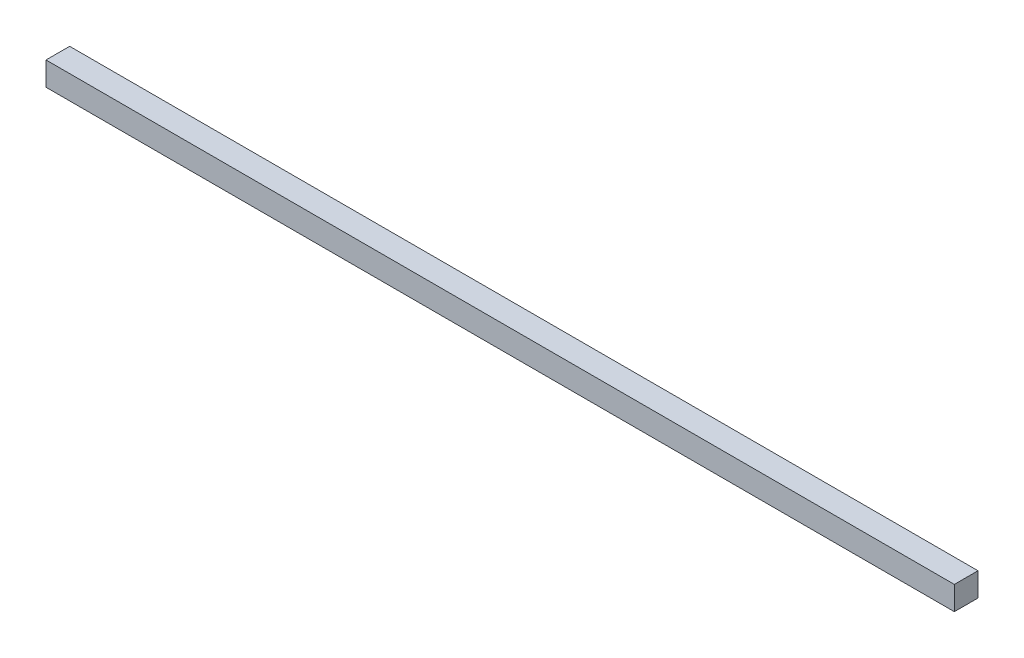
ISO-10303-21;
HEADER;
FILE_DESCRIPTION(('STEP AP214'),'2;1');
FILE_NAME('part.step','',(''),(''),'','','');
FILE_SCHEMA(('AUTOMOTIVE_DESIGN { 1 0 10303 214 1 1 1 1 }'));
ENDSEC;
DATA;
#1=APPLICATION_CONTEXT('core data for automotive mechanical design processes');
#2=APPLICATION_PROTOCOL_DEFINITION('international standard','automotive_design',2000,#1);
#3=PRODUCT_CONTEXT('',#1,'mechanical');
#4=PRODUCT('Part','Part','',(#3));
#5=PRODUCT_RELATED_PRODUCT_CATEGORY('part','',(#4));
#6=PRODUCT_DEFINITION_FORMATION('','',#4);
#7=PRODUCT_DEFINITION_CONTEXT('part definition',#1,'design');
#8=PRODUCT_DEFINITION('design','',#6,#7);
#9=PRODUCT_DEFINITION_SHAPE('','',#8);
#10=(LENGTH_UNIT() NAMED_UNIT(*) SI_UNIT(.MILLI.,.METRE.));
#11=(NAMED_UNIT(*) PLANE_ANGLE_UNIT() SI_UNIT($,.RADIAN.));
#12=(NAMED_UNIT(*) SI_UNIT($,.STERADIAN.) SOLID_ANGLE_UNIT());
#13=UNCERTAINTY_MEASURE_WITH_UNIT(LENGTH_MEASURE(1.E-05),#10,'distance_accuracy_value','');
#14=(GEOMETRIC_REPRESENTATION_CONTEXT(3) GLOBAL_UNCERTAINTY_ASSIGNED_CONTEXT((#13)) GLOBAL_UNIT_ASSIGNED_CONTEXT((#10,
#11,#12)) REPRESENTATION_CONTEXT('',''));
#15=CARTESIAN_POINT('',(0.,0.,0.));
#16=DIRECTION('',(0.,0.,1.));
#17=DIRECTION('',(1.,0.,0.));
#18=AXIS2_PLACEMENT_3D('',#15,#16,#17);
#19=CARTESIAN_POINT('',(-192.,5.,5.));
#20=DIRECTION('',(1.,0.,0.));
#21=DIRECTION('',(0.,0.,-1.));
#22=AXIS2_PLACEMENT_3D('',#19,#20,#21);
#23=PLANE('',#22);
#24=DIRECTION('',(0.,-1.,0.));
#25=VECTOR('',#24,1.);
#26=CARTESIAN_POINT('',(-192.,5.,-5.));
#27=LINE('',#26,#25);
#28=CARTESIAN_POINT('',(-192.,5.,-5.));
#29=VERTEX_POINT('',#28);
#30=CARTESIAN_POINT('',(-192.,-5.,-5.));
#31=VERTEX_POINT('',#30);
#32=EDGE_CURVE('E105',#29,#31,#27,.T.);
#33=ORIENTED_EDGE('',*,*,#32,.T.);
#34=DIRECTION('',(0.,0.,-1.));
#35=VECTOR('',#34,1.);
#36=CARTESIAN_POINT('',(-192.,-5.,5.));
#37=LINE('',#36,#35);
#38=CARTESIAN_POINT('',(-192.,-5.,5.));
#39=VERTEX_POINT('',#38);
#40=EDGE_CURVE('E11',#39,#31,#37,.T.);
#41=ORIENTED_EDGE('',*,*,#40,.F.);
#42=DIRECTION('',(0.,-1.,0.));
#43=VECTOR('',#42,1.);
#44=CARTESIAN_POINT('',(-192.,5.,5.));
#45=LINE('',#44,#43);
#46=CARTESIAN_POINT('',(-192.,5.,5.));
#47=VERTEX_POINT('',#46);
#48=EDGE_CURVE('E89',#47,#39,#45,.T.);
#49=ORIENTED_EDGE('',*,*,#48,.F.);
#50=DIRECTION('',(0.,0.,-1.));
#51=VECTOR('',#50,1.);
#52=CARTESIAN_POINT('',(-192.,5.,5.));
#53=LINE('',#52,#51);
#54=EDGE_CURVE('E98',#47,#29,#53,.T.);
#55=ORIENTED_EDGE('',*,*,#54,.T.);
#56=EDGE_LOOP('',(#33,#41,#49,#55));
#57=FACE_BOUND('',#56,.T.);
#58=ADVANCED_FACE('F39',(#57),#23,.F.);
#59=CARTESIAN_POINT('',(-192.,-5.,5.));
#60=DIRECTION('',(0.,1.,0.));
#61=DIRECTION('',(0.,0.,1.));
#62=AXIS2_PLACEMENT_3D('',#59,#60,#61);
#63=PLANE('',#62);
#64=DIRECTION('',(1.,0.,0.));
#65=VECTOR('',#64,1.);
#66=CARTESIAN_POINT('',(-192.,-5.,-5.));
#67=LINE('',#66,#65);
#68=CARTESIAN_POINT('',(192.,-5.,-5.));
#69=VERTEX_POINT('',#68);
#70=EDGE_CURVE('E94',#31,#69,#67,.T.);
#71=ORIENTED_EDGE('',*,*,#70,.T.);
#72=DIRECTION('',(0.,0.,-1.));
#73=VECTOR('',#72,1.);
#74=CARTESIAN_POINT('',(192.,-5.,5.));
#75=LINE('',#74,#73);
#76=CARTESIAN_POINT('',(192.,-5.,5.));
#77=VERTEX_POINT('',#76);
#78=EDGE_CURVE('E50',#77,#69,#75,.T.);
#79=ORIENTED_EDGE('',*,*,#78,.F.);
#80=DIRECTION('',(1.,0.,0.));
#81=VECTOR('',#80,1.);
#82=CARTESIAN_POINT('',(-192.,-5.,5.));
#83=LINE('',#82,#81);
#84=EDGE_CURVE('E84',#39,#77,#83,.T.);
#85=ORIENTED_EDGE('',*,*,#84,.F.);
#86=ORIENTED_EDGE('',*,*,#40,.T.);
#87=EDGE_LOOP('',(#71,#79,#85,#86));
#88=FACE_BOUND('',#87,.T.);
#89=ADVANCED_FACE('F91',(#88),#63,.F.);
#90=CARTESIAN_POINT('',(192.,-5.,5.));
#91=DIRECTION('',(-1.,0.,0.));
#92=DIRECTION('',(0.,0.,1.));
#93=AXIS2_PLACEMENT_3D('',#90,#91,#92);
#94=PLANE('',#93);
#95=DIRECTION('',(0.,1.,0.));
#96=VECTOR('',#95,1.);
#97=CARTESIAN_POINT('',(192.,-5.,-5.));
#98=LINE('',#97,#96);
#99=CARTESIAN_POINT('',(192.,5.,-5.));
#100=VERTEX_POINT('',#99);
#101=EDGE_CURVE('E75',#69,#100,#98,.T.);
#102=ORIENTED_EDGE('',*,*,#101,.T.);
#103=DIRECTION('',(0.,0.,-1.));
#104=VECTOR('',#103,1.);
#105=CARTESIAN_POINT('',(192.,5.,5.));
#106=LINE('',#105,#104);
#107=CARTESIAN_POINT('',(192.,5.,5.));
#108=VERTEX_POINT('',#107);
#109=EDGE_CURVE('E92',#108,#100,#106,.T.);
#110=ORIENTED_EDGE('',*,*,#109,.F.);
#111=DIRECTION('',(0.,1.,0.));
#112=VECTOR('',#111,1.);
#113=CARTESIAN_POINT('',(192.,-5.,5.));
#114=LINE('',#113,#112);
#115=EDGE_CURVE('E86',#77,#108,#114,.T.);
#116=ORIENTED_EDGE('',*,*,#115,.F.);
#117=ORIENTED_EDGE('',*,*,#78,.T.);
#118=EDGE_LOOP('',(#102,#110,#116,#117));
#119=FACE_BOUND('',#118,.T.);
#120=ADVANCED_FACE('F96',(#119),#94,.F.);
#121=CARTESIAN_POINT('',(192.,5.,5.));
#122=DIRECTION('',(0.,-1.,0.));
#123=DIRECTION('',(0.,0.,-1.));
#124=AXIS2_PLACEMENT_3D('',#121,#122,#123);
#125=PLANE('',#124);
#126=DIRECTION('',(-1.,0.,0.));
#127=VECTOR('',#126,1.);
#128=CARTESIAN_POINT('',(192.,5.,-5.));
#129=LINE('',#128,#127);
#130=EDGE_CURVE('E80',#100,#29,#129,.T.);
#131=ORIENTED_EDGE('',*,*,#130,.T.);
#132=ORIENTED_EDGE('',*,*,#54,.F.);
#133=DIRECTION('',(-1.,0.,0.));
#134=VECTOR('',#133,1.);
#135=CARTESIAN_POINT('',(192.,5.,5.));
#136=LINE('',#135,#134);
#137=EDGE_CURVE('E54',#108,#47,#136,.T.);
#138=ORIENTED_EDGE('',*,*,#137,.F.);
#139=ORIENTED_EDGE('',*,*,#109,.T.);
#140=EDGE_LOOP('',(#131,#132,#138,#139));
#141=FACE_BOUND('',#140,.T.);
#142=ADVANCED_FACE('F108',(#141),#125,.F.);
#143=CARTESIAN_POINT('',(0.,0.,5.));
#144=DIRECTION('',(0.,0.,1.));
#145=DIRECTION('',(1.,0.,0.));
#146=AXIS2_PLACEMENT_3D('',#143,#144,#145);
#147=PLANE('',#146);
#148=ORIENTED_EDGE('',*,*,#48,.T.);
#149=ORIENTED_EDGE('',*,*,#84,.T.);
#150=ORIENTED_EDGE('',*,*,#115,.T.);
#151=ORIENTED_EDGE('',*,*,#137,.T.);
#152=EDGE_LOOP('',(#148,#149,#150,#151));
#153=FACE_BOUND('',#152,.T.);
#154=ADVANCED_FACE('F88',(#153),#147,.T.);
#155=CARTESIAN_POINT('',(0.,0.,-5.));
#156=DIRECTION('',(0.,0.,1.));
#157=DIRECTION('',(1.,0.,0.));
#158=AXIS2_PLACEMENT_3D('',#155,#156,#157);
#159=PLANE('',#158);
#160=ORIENTED_EDGE('',*,*,#32,.F.);
#161=ORIENTED_EDGE('',*,*,#130,.F.);
#162=ORIENTED_EDGE('',*,*,#101,.F.);
#163=ORIENTED_EDGE('',*,*,#70,.F.);
#164=EDGE_LOOP('',(#160,#161,#162,#163));
#165=FACE_BOUND('',#164,.T.);
#166=ADVANCED_FACE('F115',(#165),#159,.F.);
#167=CLOSED_SHELL('',(#58,#89,#120,#142,#154,#166));
#168=MANIFOLD_SOLID_BREP('B2',#167);
#169=ADVANCED_BREP_SHAPE_REPRESENTATION('',(#18,#168),#14);
#170=SHAPE_DEFINITION_REPRESENTATION(#9,#169);
ENDSEC;
END-ISO-10303-21;
